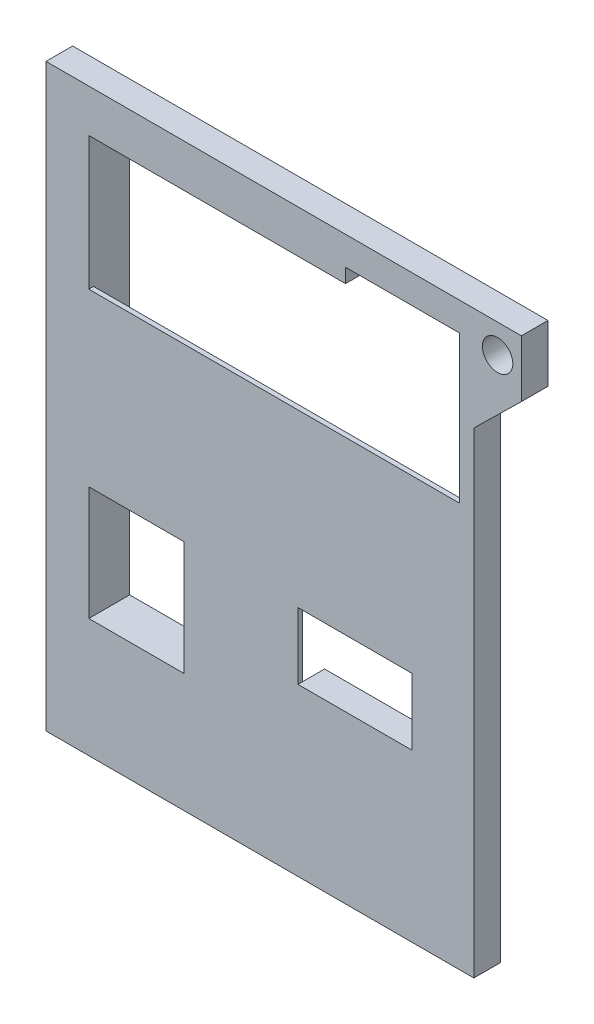
ISO-10303-21;
HEADER;
FILE_DESCRIPTION(('STEP AP214'),'2;1');
FILE_NAME('part.step','',(''),(''),'','','');
FILE_SCHEMA(('AUTOMOTIVE_DESIGN { 1 0 10303 214 1 1 1 1 }'));
ENDSEC;
DATA;
#1=APPLICATION_CONTEXT('core data for automotive mechanical design processes');
#2=APPLICATION_PROTOCOL_DEFINITION('international standard','automotive_design',2000,#1);
#3=PRODUCT_CONTEXT('',#1,'mechanical');
#4=PRODUCT('Part','Part','',(#3));
#5=PRODUCT_RELATED_PRODUCT_CATEGORY('part','',(#4));
#6=PRODUCT_DEFINITION_FORMATION('','',#4);
#7=PRODUCT_DEFINITION_CONTEXT('part definition',#1,'design');
#8=PRODUCT_DEFINITION('design','',#6,#7);
#9=PRODUCT_DEFINITION_SHAPE('','',#8);
#10=(LENGTH_UNIT() NAMED_UNIT(*) SI_UNIT(.MILLI.,.METRE.));
#11=(NAMED_UNIT(*) PLANE_ANGLE_UNIT() SI_UNIT($,.RADIAN.));
#12=(NAMED_UNIT(*) SI_UNIT($,.STERADIAN.) SOLID_ANGLE_UNIT());
#13=UNCERTAINTY_MEASURE_WITH_UNIT(LENGTH_MEASURE(1.E-05),#10,'distance_accuracy_value','');
#14=(GEOMETRIC_REPRESENTATION_CONTEXT(3) GLOBAL_UNCERTAINTY_ASSIGNED_CONTEXT((#13)) GLOBAL_UNIT_ASSIGNED_CONTEXT((#10,
#11,#12)) REPRESENTATION_CONTEXT('',''));
#15=CARTESIAN_POINT('',(0.,0.,0.));
#16=DIRECTION('',(0.,0.,1.));
#17=DIRECTION('',(1.,0.,0.));
#18=AXIS2_PLACEMENT_3D('',#15,#16,#17);
#19=CARTESIAN_POINT('',(4.00000000000001,0.,-2.8));
#20=DIRECTION('',(1.,0.,0.));
#21=DIRECTION('',(0.,0.,-1.));
#22=AXIS2_PLACEMENT_3D('',#19,#20,#21);
#23=PLANE('',#22);
#24=DIRECTION('',(0.,-1.,0.));
#25=VECTOR('',#24,1.);
#26=CARTESIAN_POINT('',(4.00000000000001,0.,-0.5));
#27=LINE('',#26,#25);
#28=CARTESIAN_POINT('',(4.00000000000001,-13.,-0.5));
#29=VERTEX_POINT('',#28);
#30=CARTESIAN_POINT('',(4.00000000000001,-18.,-0.5));
#31=VERTEX_POINT('',#30);
#32=EDGE_CURVE('E67',#29,#31,#27,.T.);
#33=ORIENTED_EDGE('',*,*,#32,.F.);
#34=DIRECTION('',(0.,0.,1.));
#35=VECTOR('',#34,1.);
#36=CARTESIAN_POINT('',(4.00000000000001,-13.,-2.8));
#37=LINE('',#36,#35);
#38=CARTESIAN_POINT('',(4.00000000000001,-13.,-2.8));
#39=VERTEX_POINT('',#38);
#40=EDGE_CURVE('E449',#39,#29,#37,.T.);
#41=ORIENTED_EDGE('',*,*,#40,.F.);
#42=DIRECTION('',(0.,1.,0.));
#43=VECTOR('',#42,1.);
#44=CARTESIAN_POINT('',(4.00000000000001,0.,-2.8));
#45=LINE('',#44,#43);
#46=CARTESIAN_POINT('',(4.00000000000001,-18.,-2.8));
#47=VERTEX_POINT('',#46);
#48=EDGE_CURVE('E377',#47,#39,#45,.T.);
#49=ORIENTED_EDGE('',*,*,#48,.F.);
#50=DIRECTION('',(0.,0.,1.));
#51=VECTOR('',#50,1.);
#52=CARTESIAN_POINT('',(4.00000000000001,-18.,-2.8));
#53=LINE('',#52,#51);
#54=EDGE_CURVE('E447',#47,#31,#53,.T.);
#55=ORIENTED_EDGE('',*,*,#54,.T.);
#56=EDGE_LOOP('',(#33,#41,#49,#55));
#57=FACE_BOUND('',#56,.T.);
#58=ADVANCED_FACE('F50',(#57),#23,.F.);
#59=CARTESIAN_POINT('',(0.,-9.27900262121284,-2.8));
#60=DIRECTION('',(0.,-1.,0.));
#61=DIRECTION('',(0.,0.,-1.));
#62=AXIS2_PLACEMENT_3D('',#59,#60,#61);
#63=PLANE('',#62);
#64=DIRECTION('',(1.,0.,0.));
#65=VECTOR('',#64,1.);
#66=CARTESIAN_POINT('',(0.,-9.27900262121284,-0.5));
#67=LINE('',#66,#65);
#68=CARTESIAN_POINT('',(16.,-9.27900262121284,-0.5));
#69=VERTEX_POINT('',#68);
#70=CARTESIAN_POINT('',(21.,-9.27900262121284,-0.5));
#71=VERTEX_POINT('',#70);
#72=EDGE_CURVE('E316',#69,#71,#67,.T.);
#73=ORIENTED_EDGE('',*,*,#72,.T.);
#74=DIRECTION('',(0.,0.,1.));
#75=VECTOR('',#74,1.);
#76=CARTESIAN_POINT('',(21.,-9.27900262121284,-2.8));
#77=LINE('',#76,#75);
#78=CARTESIAN_POINT('',(21.,-9.27900262121284,-2.8));
#79=VERTEX_POINT('',#78);
#80=EDGE_CURVE('E455',#79,#71,#77,.T.);
#81=ORIENTED_EDGE('',*,*,#80,.F.);
#82=DIRECTION('',(1.,0.,0.));
#83=VECTOR('',#82,1.);
#84=CARTESIAN_POINT('',(0.,-9.27900262121284,-2.8));
#85=LINE('',#84,#83);
#86=CARTESIAN_POINT('',(16.,-9.27900262121284,-2.8));
#87=VERTEX_POINT('',#86);
#88=EDGE_CURVE('E370',#87,#79,#85,.T.);
#89=ORIENTED_EDGE('',*,*,#88,.F.);
#90=DIRECTION('',(0.,0.,1.));
#91=VECTOR('',#90,1.);
#92=CARTESIAN_POINT('',(16.,-9.27900262121284,-2.8));
#93=LINE('',#92,#91);
#94=EDGE_CURVE('E75',#87,#69,#93,.T.);
#95=ORIENTED_EDGE('',*,*,#94,.T.);
#96=EDGE_LOOP('',(#73,#81,#89,#95));
#97=FACE_BOUND('',#96,.T.);
#98=ADVANCED_FACE('F489',(#97),#63,.F.);
#99=CARTESIAN_POINT('',(21.,0.,-2.8));
#100=DIRECTION('',(1.,0.,0.));
#101=DIRECTION('',(0.,0.,-1.));
#102=AXIS2_PLACEMENT_3D('',#99,#100,#101);
#103=PLANE('',#102);
#104=DIRECTION('',(0.,-1.,0.));
#105=VECTOR('',#104,1.);
#106=CARTESIAN_POINT('',(21.,0.,-0.5));
#107=LINE('',#106,#105);
#108=CARTESIAN_POINT('',(21.,12.,-0.5));
#109=VERTEX_POINT('',#108);
#110=EDGE_CURVE('E350',#109,#71,#107,.T.);
#111=ORIENTED_EDGE('',*,*,#110,.F.);
#112=DIRECTION('',(0.,0.,1.));
#113=VECTOR('',#112,1.);
#114=CARTESIAN_POINT('',(21.,12.,-0.5));
#115=LINE('',#114,#113);
#116=CARTESIAN_POINT('',(21.,12.,0.));
#117=VERTEX_POINT('',#116);
#118=EDGE_CURVE('E318',#109,#117,#115,.T.);
#119=ORIENTED_EDGE('',*,*,#118,.T.);
#120=DIRECTION('',(0.,1.,0.));
#121=VECTOR('',#120,1.);
#122=CARTESIAN_POINT('',(21.,0.,0.));
#123=LINE('',#122,#121);
#124=CARTESIAN_POINT('',(21.,27.5,0.));
#125=VERTEX_POINT('',#124);
#126=EDGE_CURVE('E411',#117,#125,#123,.T.);
#127=ORIENTED_EDGE('',*,*,#126,.T.);
#128=DIRECTION('',(0.,0.,1.));
#129=VECTOR('',#128,1.);
#130=CARTESIAN_POINT('',(21.,27.5,-2.8));
#131=LINE('',#130,#129);
#132=CARTESIAN_POINT('',(21.,27.5,-2.8));
#133=VERTEX_POINT('',#132);
#134=EDGE_CURVE('E458',#133,#125,#131,.T.);
#135=ORIENTED_EDGE('',*,*,#134,.F.);
#136=DIRECTION('',(0.,1.,0.));
#137=VECTOR('',#136,1.);
#138=CARTESIAN_POINT('',(21.,0.,-2.8));
#139=LINE('',#138,#137);
#140=EDGE_CURVE('E368',#79,#133,#139,.T.);
#141=ORIENTED_EDGE('',*,*,#140,.F.);
#142=ORIENTED_EDGE('',*,*,#80,.T.);
#143=EDGE_LOOP('',(#111,#119,#127,#135,#141,#142));
#144=FACE_BOUND('',#143,.T.);
#145=ADVANCED_FACE('F494',(#144),#103,.F.);
#146=CARTESIAN_POINT('',(0.,-30.5,-2.8));
#147=DIRECTION('',(0.,1.,0.));
#148=DIRECTION('',(-1.,0.,0.));
#149=AXIS2_PLACEMENT_3D('',#146,#147,#148);
#150=PLANE('',#149);
#151=DIRECTION('',(-1.,0.,0.));
#152=VECTOR('',#151,1.);
#153=CARTESIAN_POINT('',(0.,-30.5,0.));
#154=LINE('',#153,#152);
#155=CARTESIAN_POINT('',(22.5,-30.5,0.));
#156=VERTEX_POINT('',#155);
#157=CARTESIAN_POINT('',(-22.5,-30.5,0.));
#158=VERTEX_POINT('',#157);
#159=EDGE_CURVE('E418',#156,#158,#154,.T.);
#160=ORIENTED_EDGE('',*,*,#159,.T.);
#161=DIRECTION('',(0.,0.,1.));
#162=VECTOR('',#161,1.);
#163=CARTESIAN_POINT('',(-22.5,-30.5,-2.8));
#164=LINE('',#163,#162);
#165=CARTESIAN_POINT('',(-22.5,-30.5,-2.8));
#166=VERTEX_POINT('',#165);
#167=EDGE_CURVE('E12',#166,#158,#164,.T.);
#168=ORIENTED_EDGE('',*,*,#167,.F.);
#169=DIRECTION('',(-1.,0.,0.));
#170=VECTOR('',#169,1.);
#171=CARTESIAN_POINT('',(0.,-30.5,-2.8));
#172=LINE('',#171,#170);
#173=CARTESIAN_POINT('',(22.5,-30.5,-2.8));
#174=VERTEX_POINT('',#173);
#175=EDGE_CURVE('E385',#174,#166,#172,.T.);
#176=ORIENTED_EDGE('',*,*,#175,.F.);
#177=DIRECTION('',(0.,0.,1.));
#178=VECTOR('',#177,1.);
#179=CARTESIAN_POINT('',(22.5,-30.5,-2.8));
#180=LINE('',#179,#178);
#181=EDGE_CURVE('E445',#174,#156,#180,.T.);
#182=ORIENTED_EDGE('',*,*,#181,.T.);
#183=EDGE_LOOP('',(#160,#168,#176,#182));
#184=FACE_BOUND('',#183,.T.);
#185=ADVANCED_FACE('F590',(#184),#150,.F.);
#186=CARTESIAN_POINT('',(-22.5,0.,-2.8));
#187=DIRECTION('',(1.,0.,0.));
#188=DIRECTION('',(0.,0.,-1.));
#189=AXIS2_PLACEMENT_3D('',#186,#187,#188);
#190=PLANE('',#189);
#191=DIRECTION('',(0.,1.,0.));
#192=VECTOR('',#191,1.);
#193=CARTESIAN_POINT('',(-22.5,0.,0.));
#194=LINE('',#193,#192);
#195=CARTESIAN_POINT('',(-22.5,30.5,0.));
#196=VERTEX_POINT('',#195);
#197=EDGE_CURVE('E432',#158,#196,#194,.T.);
#198=ORIENTED_EDGE('',*,*,#197,.T.);
#199=DIRECTION('',(0.,0.,1.));
#200=VECTOR('',#199,1.);
#201=CARTESIAN_POINT('',(-22.5,30.5,-2.8));
#202=LINE('',#201,#200);
#203=CARTESIAN_POINT('',(-22.5,30.5,-2.8));
#204=VERTEX_POINT('',#203);
#205=EDGE_CURVE('E59',#204,#196,#202,.T.);
#206=ORIENTED_EDGE('',*,*,#205,.F.);
#207=DIRECTION('',(0.,1.,0.));
#208=VECTOR('',#207,1.);
#209=CARTESIAN_POINT('',(-22.5,0.,-2.8));
#210=LINE('',#209,#208);
#211=EDGE_CURVE('E398',#166,#204,#210,.T.);
#212=ORIENTED_EDGE('',*,*,#211,.F.);
#213=ORIENTED_EDGE('',*,*,#167,.T.);
#214=EDGE_LOOP('',(#198,#206,#212,#213));
#215=FACE_BOUND('',#214,.T.);
#216=ADVANCED_FACE('F586',(#215),#190,.F.);
#217=CARTESIAN_POINT('',(0.,30.5,-2.8));
#218=DIRECTION('',(0.,1.,0.));
#219=DIRECTION('',(-1.,0.,0.));
#220=AXIS2_PLACEMENT_3D('',#217,#218,#219);
#221=PLANE('',#220);
#222=ORIENTED_EDGE('',*,*,#205,.T.);
#223=DIRECTION('',(-1.,0.,0.));
#224=VECTOR('',#223,1.);
#225=CARTESIAN_POINT('',(0.,30.5,0.));
#226=LINE('',#225,#224);
#227=CARTESIAN_POINT('',(27.5,30.5,0.));
#228=VERTEX_POINT('',#227);
#229=EDGE_CURVE('E429',#228,#196,#226,.T.);
#230=ORIENTED_EDGE('',*,*,#229,.F.);
#231=DIRECTION('',(0.,0.,1.));
#232=VECTOR('',#231,1.);
#233=CARTESIAN_POINT('',(27.5,30.5,-2.8));
#234=LINE('',#233,#232);
#235=CARTESIAN_POINT('',(27.5,30.5,-2.8));
#236=VERTEX_POINT('',#235);
#237=EDGE_CURVE('E438',#236,#228,#234,.T.);
#238=ORIENTED_EDGE('',*,*,#237,.F.);
#239=DIRECTION('',(-1.,0.,0.));
#240=VECTOR('',#239,1.);
#241=CARTESIAN_POINT('',(0.,30.5,-2.8));
#242=LINE('',#241,#240);
#243=EDGE_CURVE('E395',#236,#204,#242,.T.);
#244=ORIENTED_EDGE('',*,*,#243,.T.);
#245=EDGE_LOOP('',(#222,#230,#238,#244));
#246=FACE_BOUND('',#245,.T.);
#247=ADVANCED_FACE('F589',(#246),#221,.T.);
#248=CARTESIAN_POINT('',(27.5,0.,-2.8));
#249=DIRECTION('',(-1.,0.,0.));
#250=DIRECTION('',(0.,0.,1.));
#251=AXIS2_PLACEMENT_3D('',#248,#249,#250);
#252=PLANE('',#251);
#253=DIRECTION('',(0.,-1.,0.));
#254=VECTOR('',#253,1.);
#255=CARTESIAN_POINT('',(27.5,0.,0.));
#256=LINE('',#255,#254);
#257=CARTESIAN_POINT('',(27.5,24.5,0.));
#258=VERTEX_POINT('',#257);
#259=EDGE_CURVE('E427',#228,#258,#256,.T.);
#260=ORIENTED_EDGE('',*,*,#259,.T.);
#261=DIRECTION('',(0.,0.,1.));
#262=VECTOR('',#261,1.);
#263=CARTESIAN_POINT('',(27.5,24.5,-2.8));
#264=LINE('',#263,#262);
#265=CARTESIAN_POINT('',(27.5,24.5,-2.8));
#266=VERTEX_POINT('',#265);
#267=EDGE_CURVE('E440',#266,#258,#264,.T.);
#268=ORIENTED_EDGE('',*,*,#267,.F.);
#269=DIRECTION('',(0.,-1.,0.));
#270=VECTOR('',#269,1.);
#271=CARTESIAN_POINT('',(27.5,0.,-2.8));
#272=LINE('',#271,#270);
#273=EDGE_CURVE('E393',#236,#266,#272,.T.);
#274=ORIENTED_EDGE('',*,*,#273,.F.);
#275=ORIENTED_EDGE('',*,*,#237,.T.);
#276=EDGE_LOOP('',(#260,#268,#274,#275));
#277=FACE_BOUND('',#276,.T.);
#278=ADVANCED_FACE('F594',(#277),#252,.F.);
#279=CARTESIAN_POINT('',(1.22193904118613,-1.24713631153823,-2.8));
#280=DIRECTION('',(-0.699854212223765,0.714285714285715,0.));
#281=DIRECTION('',(-0.714285714285715,-0.699854212223765,0.));
#282=AXIS2_PLACEMENT_3D('',#279,#280,#281);
#283=PLANE('',#282);
#284=DIRECTION('',(-0.714285714285715,-0.699854212223765,0.));
#285=VECTOR('',#284,1.);
#286=CARTESIAN_POINT('',(1.22193904118613,-1.24713631153823,0.));
#287=LINE('',#286,#285);
#288=CARTESIAN_POINT('',(22.5,19.6010205144337,0.));
#289=VERTEX_POINT('',#288);
#290=EDGE_CURVE('E424',#258,#289,#287,.T.);
#291=ORIENTED_EDGE('',*,*,#290,.T.);
#292=DIRECTION('',(0.,0.,1.));
#293=VECTOR('',#292,1.);
#294=CARTESIAN_POINT('',(22.5,19.6010205144337,-2.8));
#295=LINE('',#294,#293);
#296=CARTESIAN_POINT('',(22.5,19.6010205144337,-2.8));
#297=VERTEX_POINT('',#296);
#298=EDGE_CURVE('E443',#297,#289,#295,.T.);
#299=ORIENTED_EDGE('',*,*,#298,.F.);
#300=DIRECTION('',(-0.714285714285715,-0.699854212223765,0.));
#301=VECTOR('',#300,1.);
#302=CARTESIAN_POINT('',(1.22193904118613,-1.24713631153823,-2.8));
#303=LINE('',#302,#301);
#304=EDGE_CURVE('E391',#266,#297,#303,.T.);
#305=ORIENTED_EDGE('',*,*,#304,.F.);
#306=ORIENTED_EDGE('',*,*,#267,.T.);
#307=EDGE_LOOP('',(#291,#299,#305,#306));
#308=FACE_BOUND('',#307,.T.);
#309=ADVANCED_FACE('F503',(#308),#283,.F.);
#310=CARTESIAN_POINT('',(0.,-13.,-2.8));
#311=DIRECTION('',(0.,-1.,0.));
#312=DIRECTION('',(0.,0.,-1.));
#313=AXIS2_PLACEMENT_3D('',#310,#311,#312);
#314=PLANE('',#313);
#315=DIRECTION('',(1.,0.,0.));
#316=VECTOR('',#315,1.);
#317=CARTESIAN_POINT('',(0.,-13.,0.));
#318=LINE('',#317,#316);
#319=CARTESIAN_POINT('',(4.00000000000001,-13.,0.));
#320=VERTEX_POINT('',#319);
#321=CARTESIAN_POINT('',(16.,-13.,0.));
#322=VERTEX_POINT('',#321);
#323=EDGE_CURVE('E416',#320,#322,#318,.T.);
#324=ORIENTED_EDGE('',*,*,#323,.T.);
#325=DIRECTION('',(0.,0.,1.));
#326=VECTOR('',#325,1.);
#327=CARTESIAN_POINT('',(16.,-13.,-2.8));
#328=LINE('',#327,#326);
#329=CARTESIAN_POINT('',(16.,-13.,-2.8));
#330=VERTEX_POINT('',#329);
#331=EDGE_CURVE('E451',#330,#322,#328,.T.);
#332=ORIENTED_EDGE('',*,*,#331,.F.);
#333=DIRECTION('',(1.,0.,0.));
#334=VECTOR('',#333,1.);
#335=CARTESIAN_POINT('',(0.,-13.,-2.8));
#336=LINE('',#335,#334);
#337=EDGE_CURVE('E375',#39,#330,#336,.T.);
#338=ORIENTED_EDGE('',*,*,#337,.F.);
#339=ORIENTED_EDGE('',*,*,#40,.T.);
#340=DIRECTION('',(0.,0.,-1.));
#341=VECTOR('',#340,1.);
#342=CARTESIAN_POINT('',(4.00000000000001,-13.,-2.8));
#343=LINE('',#342,#341);
#344=EDGE_CURVE('E332',#320,#29,#343,.T.);
#345=ORIENTED_EDGE('',*,*,#344,.F.);
#346=EDGE_LOOP('',(#324,#332,#338,#339,#345));
#347=FACE_BOUND('',#346,.T.);
#348=ADVANCED_FACE('F499',(#347),#314,.F.);
#349=CARTESIAN_POINT('',(16.,0.,-2.8));
#350=DIRECTION('',(1.,0.,0.));
#351=DIRECTION('',(0.,1.,0.));
#352=AXIS2_PLACEMENT_3D('',#349,#350,#351);
#353=PLANE('',#352);
#354=DIRECTION('',(0.,1.,0.));
#355=VECTOR('',#354,1.);
#356=CARTESIAN_POINT('',(16.,0.,0.));
#357=LINE('',#356,#355);
#358=CARTESIAN_POINT('',(16.,-5.99999999999999,0.));
#359=VERTEX_POINT('',#358);
#360=EDGE_CURVE('E414',#322,#359,#357,.T.);
#361=ORIENTED_EDGE('',*,*,#360,.T.);
#362=DIRECTION('',(0.,0.,1.));
#363=VECTOR('',#362,1.);
#364=CARTESIAN_POINT('',(16.,-5.99999999999999,-0.5));
#365=LINE('',#364,#363);
#366=CARTESIAN_POINT('',(16.,-5.99999999999999,-0.5));
#367=VERTEX_POINT('',#366);
#368=EDGE_CURVE('E329',#367,#359,#365,.T.);
#369=ORIENTED_EDGE('',*,*,#368,.F.);
#370=DIRECTION('',(0.,1.,0.));
#371=VECTOR('',#370,1.);
#372=CARTESIAN_POINT('',(16.,0.,-0.5));
#373=LINE('',#372,#371);
#374=EDGE_CURVE('E314',#69,#367,#373,.T.);
#375=ORIENTED_EDGE('',*,*,#374,.F.);
#376=ORIENTED_EDGE('',*,*,#94,.F.);
#377=DIRECTION('',(0.,1.,0.));
#378=VECTOR('',#377,1.);
#379=CARTESIAN_POINT('',(16.,0.,-2.8));
#380=LINE('',#379,#378);
#381=EDGE_CURVE('E373',#330,#87,#380,.T.);
#382=ORIENTED_EDGE('',*,*,#381,.F.);
#383=ORIENTED_EDGE('',*,*,#331,.T.);
#384=EDGE_LOOP('',(#361,#369,#375,#376,#382,#383));
#385=FACE_BOUND('',#384,.T.);
#386=ADVANCED_FACE('F502',(#385),#353,.F.);
#387=CARTESIAN_POINT('',(0.,27.5,-2.8));
#388=DIRECTION('',(0.,-1.,0.));
#389=DIRECTION('',(0.,0.,-1.));
#390=AXIS2_PLACEMENT_3D('',#387,#388,#389);
#391=PLANE('',#390);
#392=DIRECTION('',(1.,0.,0.));
#393=VECTOR('',#392,1.);
#394=CARTESIAN_POINT('',(0.,27.5,0.));
#395=LINE('',#394,#393);
#396=CARTESIAN_POINT('',(9.00000000000001,27.5,0.));
#397=VERTEX_POINT('',#396);
#398=EDGE_CURVE('E408',#397,#125,#395,.T.);
#399=ORIENTED_EDGE('',*,*,#398,.F.);
#400=DIRECTION('',(0.,0.,1.));
#401=VECTOR('',#400,1.);
#402=CARTESIAN_POINT('',(9.00000000000001,27.5,-2.8));
#403=LINE('',#402,#401);
#404=CARTESIAN_POINT('',(9.00000000000001,27.5,-2.8));
#405=VERTEX_POINT('',#404);
#406=EDGE_CURVE('E460',#405,#397,#403,.T.);
#407=ORIENTED_EDGE('',*,*,#406,.F.);
#408=DIRECTION('',(1.,0.,0.));
#409=VECTOR('',#408,1.);
#410=CARTESIAN_POINT('',(0.,27.5,-2.8));
#411=LINE('',#410,#409);
#412=EDGE_CURVE('E365',#405,#133,#411,.T.);
#413=ORIENTED_EDGE('',*,*,#412,.T.);
#414=ORIENTED_EDGE('',*,*,#134,.T.);
#415=EDGE_LOOP('',(#399,#407,#413,#414));
#416=FACE_BOUND('',#415,.T.);
#417=ADVANCED_FACE('F486',(#416),#391,.T.);
#418=CARTESIAN_POINT('',(9.00000000000001,0.,-2.8));
#419=DIRECTION('',(1.,0.,0.));
#420=DIRECTION('',(0.,0.,-1.));
#421=AXIS2_PLACEMENT_3D('',#418,#419,#420);
#422=PLANE('',#421);
#423=DIRECTION('',(0.,1.,0.));
#424=VECTOR('',#423,1.);
#425=CARTESIAN_POINT('',(9.00000000000001,0.,0.));
#426=LINE('',#425,#424);
#427=CARTESIAN_POINT('',(9.00000000000001,26.,0.));
#428=VERTEX_POINT('',#427);
#429=EDGE_CURVE('E405',#428,#397,#426,.T.);
#430=ORIENTED_EDGE('',*,*,#429,.F.);
#431=DIRECTION('',(0.,0.,1.));
#432=VECTOR('',#431,1.);
#433=CARTESIAN_POINT('',(9.00000000000001,26.,-2.8));
#434=LINE('',#433,#432);
#435=CARTESIAN_POINT('',(9.00000000000001,26.,-2.8));
#436=VERTEX_POINT('',#435);
#437=EDGE_CURVE('E461',#436,#428,#434,.T.);
#438=ORIENTED_EDGE('',*,*,#437,.F.);
#439=DIRECTION('',(0.,1.,0.));
#440=VECTOR('',#439,1.);
#441=CARTESIAN_POINT('',(9.00000000000001,0.,-2.8));
#442=LINE('',#441,#440);
#443=EDGE_CURVE('E362',#436,#405,#442,.T.);
#444=ORIENTED_EDGE('',*,*,#443,.T.);
#445=ORIENTED_EDGE('',*,*,#406,.T.);
#446=EDGE_LOOP('',(#430,#438,#444,#445));
#447=FACE_BOUND('',#446,.T.);
#448=ADVANCED_FACE('F478',(#447),#422,.T.);
#449=CARTESIAN_POINT('',(0.,26.,-2.8));
#450=DIRECTION('',(0.,-1.,0.));
#451=DIRECTION('',(0.,0.,-1.));
#452=AXIS2_PLACEMENT_3D('',#449,#450,#451);
#453=PLANE('',#452);
#454=DIRECTION('',(1.,0.,0.));
#455=VECTOR('',#454,1.);
#456=CARTESIAN_POINT('',(0.,26.,0.));
#457=LINE('',#456,#455);
#458=CARTESIAN_POINT('',(-18.,26.,0.));
#459=VERTEX_POINT('',#458);
#460=EDGE_CURVE('E353',#459,#428,#457,.T.);
#461=ORIENTED_EDGE('',*,*,#460,.F.);
#462=DIRECTION('',(0.,0.,1.));
#463=VECTOR('',#462,1.);
#464=CARTESIAN_POINT('',(-18.,26.,-2.8));
#465=LINE('',#464,#463);
#466=CARTESIAN_POINT('',(-18.,26.,-2.8));
#467=VERTEX_POINT('',#466);
#468=EDGE_CURVE('E54',#467,#459,#465,.T.);
#469=ORIENTED_EDGE('',*,*,#468,.F.);
#470=DIRECTION('',(1.,0.,0.));
#471=VECTOR('',#470,1.);
#472=CARTESIAN_POINT('',(0.,26.,-2.8));
#473=LINE('',#472,#471);
#474=EDGE_CURVE('E359',#467,#436,#473,.T.);
#475=ORIENTED_EDGE('',*,*,#474,.T.);
#476=ORIENTED_EDGE('',*,*,#437,.T.);
#477=EDGE_LOOP('',(#461,#469,#475,#476));
#478=FACE_BOUND('',#477,.T.);
#479=ADVANCED_FACE('F52',(#478),#453,.T.);
#480=CARTESIAN_POINT('',(22.5,0.,-2.8));
#481=DIRECTION('',(1.,0.,0.));
#482=DIRECTION('',(0.,0.,-1.));
#483=AXIS2_PLACEMENT_3D('',#480,#481,#482);
#484=PLANE('',#483);
#485=DIRECTION('',(0.,1.,0.));
#486=VECTOR('',#485,1.);
#487=CARTESIAN_POINT('',(22.5,0.,0.));
#488=LINE('',#487,#486);
#489=EDGE_CURVE('E421',#156,#289,#488,.T.);
#490=ORIENTED_EDGE('',*,*,#489,.F.);
#491=ORIENTED_EDGE('',*,*,#181,.F.);
#492=DIRECTION('',(0.,1.,0.));
#493=VECTOR('',#492,1.);
#494=CARTESIAN_POINT('',(22.5,0.,-2.8));
#495=LINE('',#494,#493);
#496=EDGE_CURVE('E388',#174,#297,#495,.T.);
#497=ORIENTED_EDGE('',*,*,#496,.T.);
#498=ORIENTED_EDGE('',*,*,#298,.T.);
#499=EDGE_LOOP('',(#490,#491,#497,#498));
#500=FACE_BOUND('',#499,.T.);
#501=ADVANCED_FACE('F477',(#500),#484,.T.);
#502=CARTESIAN_POINT('',(25.,27.5,-2.8));
#503=DIRECTION('',(0.,0.,1.));
#504=DIRECTION('',(1.,0.,0.));
#505=AXIS2_PLACEMENT_3D('',#502,#503,#504);
#506=CYLINDRICAL_SURFACE('',#505,1.6);
#507=CARTESIAN_POINT('',(25.,27.5,-2.8));
#508=DIRECTION('',(0.,0.,1.));
#509=DIRECTION('',(1.,0.,0.));
#510=AXIS2_PLACEMENT_3D('',#507,#508,#509);
#511=CIRCLE('',#510,1.6);
#512=CARTESIAN_POINT('',(26.6,27.5,-2.8));
#513=VERTEX_POINT('',#512);
#514=EDGE_CURVE('E400',#513,#513,#511,.T.);
#515=ORIENTED_EDGE('',*,*,#514,.F.);
#516=EDGE_LOOP('',(#515));
#517=FACE_BOUND('',#516,.T.);
#518=CARTESIAN_POINT('',(25.,27.5,0.));
#519=DIRECTION('',(0.,0.,1.));
#520=DIRECTION('',(1.,0.,0.));
#521=AXIS2_PLACEMENT_3D('',#518,#519,#520);
#522=CIRCLE('',#521,1.6);
#523=CARTESIAN_POINT('',(26.6,27.5,0.));
#524=VERTEX_POINT('',#523);
#525=EDGE_CURVE('E357',#524,#524,#522,.T.);
#526=ORIENTED_EDGE('',*,*,#525,.T.);
#527=EDGE_LOOP('',(#526));
#528=FACE_BOUND('',#527,.T.);
#529=ADVANCED_FACE('F483',(#517,#528),#506,.F.);
#530=CARTESIAN_POINT('',(0.,0.,-2.8));
#531=DIRECTION('',(0.,0.,1.));
#532=DIRECTION('',(1.,0.,0.));
#533=AXIS2_PLACEMENT_3D('',#530,#531,#532);
#534=PLANE('',#533);
#535=DIRECTION('',(-1.,0.,0.));
#536=VECTOR('',#535,1.);
#537=CARTESIAN_POINT('',(0.,29.,-2.8));
#538=LINE('',#537,#536);
#539=CARTESIAN_POINT('',(-18.,29.,-2.8));
#540=VERTEX_POINT('',#539);
#541=CARTESIAN_POINT('',(-20.5,29.,-2.8));
#542=VERTEX_POINT('',#541);
#543=EDGE_CURVE('E354',#540,#542,#538,.T.);
#544=ORIENTED_EDGE('',*,*,#543,.T.);
#545=DIRECTION('',(0.,-1.,0.));
#546=VECTOR('',#545,1.);
#547=CARTESIAN_POINT('',(-20.5,0.,-2.8));
#548=LINE('',#547,#546);
#549=CARTESIAN_POINT('',(-20.5,-29.,-2.8));
#550=VERTEX_POINT('',#549);
#551=EDGE_CURVE('E248',#542,#550,#548,.T.);
#552=ORIENTED_EDGE('',*,*,#551,.T.);
#553=DIRECTION('',(-1.,0.,0.));
#554=VECTOR('',#553,1.);
#555=CARTESIAN_POINT('',(0.,-29.,-2.8));
#556=LINE('',#555,#554);
#557=CARTESIAN_POINT('',(21.,-29.,-2.8));
#558=VERTEX_POINT('',#557);
#559=EDGE_CURVE('E382',#558,#550,#556,.T.);
#560=ORIENTED_EDGE('',*,*,#559,.F.);
#561=CARTESIAN_POINT('',(21.,-18.,-2.8));
#562=VERTEX_POINT('',#561);
#563=EDGE_CURVE('E371',#558,#562,#139,.T.);
#564=ORIENTED_EDGE('',*,*,#563,.T.);
#565=DIRECTION('',(-1.,0.,0.));
#566=VECTOR('',#565,1.);
#567=CARTESIAN_POINT('',(0.,-18.,-2.8));
#568=LINE('',#567,#566);
#569=EDGE_CURVE('E379',#562,#47,#568,.T.);
#570=ORIENTED_EDGE('',*,*,#569,.T.);
#571=ORIENTED_EDGE('',*,*,#48,.T.);
#572=ORIENTED_EDGE('',*,*,#337,.T.);
#573=ORIENTED_EDGE('',*,*,#381,.T.);
#574=ORIENTED_EDGE('',*,*,#88,.T.);
#575=ORIENTED_EDGE('',*,*,#140,.T.);
#576=ORIENTED_EDGE('',*,*,#412,.F.);
#577=ORIENTED_EDGE('',*,*,#443,.F.);
#578=ORIENTED_EDGE('',*,*,#474,.F.);
#579=DIRECTION('',(0.,-1.,0.));
#580=VECTOR('',#579,1.);
#581=CARTESIAN_POINT('',(-18.,0.,-2.8));
#582=LINE('',#581,#580);
#583=EDGE_CURVE('E356',#540,#467,#582,.T.);
#584=ORIENTED_EDGE('',*,*,#583,.F.);
#585=EDGE_LOOP('',(#544,#552,#560,#564,#570,#571,#572,#573,#574,#575,#576,#577,#578,#584));
#586=FACE_BOUND('',#585,.T.);
#587=ORIENTED_EDGE('',*,*,#175,.T.);
#588=ORIENTED_EDGE('',*,*,#211,.T.);
#589=ORIENTED_EDGE('',*,*,#243,.F.);
#590=ORIENTED_EDGE('',*,*,#273,.T.);
#591=ORIENTED_EDGE('',*,*,#304,.T.);
#592=ORIENTED_EDGE('',*,*,#496,.F.);
#593=EDGE_LOOP('',(#587,#588,#589,#590,#591,#592));
#594=FACE_BOUND('',#593,.T.);
#595=ORIENTED_EDGE('',*,*,#514,.T.);
#596=EDGE_LOOP('',(#595));
#597=FACE_BOUND('',#596,.T.);
#598=ADVANCED_FACE('F517',(#586,#594,#597),#534,.F.);
#599=CARTESIAN_POINT('',(0.,0.,0.));
#600=DIRECTION('',(0.,0.,1.));
#601=DIRECTION('',(1.,0.,0.));
#602=AXIS2_PLACEMENT_3D('',#599,#600,#601);
#603=PLANE('',#602);
#604=DIRECTION('',(0.,-1.,0.));
#605=VECTOR('',#604,1.);
#606=CARTESIAN_POINT('',(-18.,0.,0.));
#607=LINE('',#606,#605);
#608=CARTESIAN_POINT('',(-18.,12.,0.));
#609=VERTEX_POINT('',#608);
#610=EDGE_CURVE('E268',#459,#609,#607,.T.);
#611=ORIENTED_EDGE('',*,*,#610,.F.);
#612=ORIENTED_EDGE('',*,*,#460,.T.);
#613=ORIENTED_EDGE('',*,*,#429,.T.);
#614=ORIENTED_EDGE('',*,*,#398,.T.);
#615=ORIENTED_EDGE('',*,*,#126,.F.);
#616=DIRECTION('',(1.,0.,0.));
#617=VECTOR('',#616,1.);
#618=CARTESIAN_POINT('',(0.,12.,0.));
#619=LINE('',#618,#617);
#620=EDGE_CURVE('E285',#609,#117,#619,.T.);
#621=ORIENTED_EDGE('',*,*,#620,.F.);
#622=EDGE_LOOP('',(#611,#612,#613,#614,#615,#621));
#623=FACE_BOUND('',#622,.T.);
#624=DIRECTION('',(0.,1.,0.));
#625=VECTOR('',#624,1.);
#626=CARTESIAN_POINT('',(-7.99999999999999,0.,0.));
#627=LINE('',#626,#625);
#628=CARTESIAN_POINT('',(-7.99999999999999,-18.,0.));
#629=VERTEX_POINT('',#628);
#630=CARTESIAN_POINT('',(-7.99999999999999,-5.99999999999999,0.));
#631=VERTEX_POINT('',#630);
#632=EDGE_CURVE('E324',#629,#631,#627,.T.);
#633=ORIENTED_EDGE('',*,*,#632,.F.);
#634=DIRECTION('',(-1.,0.,0.));
#635=VECTOR('',#634,1.);
#636=CARTESIAN_POINT('',(0.,-18.,0.));
#637=LINE('',#636,#635);
#638=CARTESIAN_POINT('',(-18.,-18.,0.));
#639=VERTEX_POINT('',#638);
#640=EDGE_CURVE('E281',#629,#639,#637,.T.);
#641=ORIENTED_EDGE('',*,*,#640,.T.);
#642=CARTESIAN_POINT('',(-18.,-5.99999999999999,0.));
#643=VERTEX_POINT('',#642);
#644=EDGE_CURVE('E270',#643,#639,#607,.T.);
#645=ORIENTED_EDGE('',*,*,#644,.F.);
#646=DIRECTION('',(-1.,0.,0.));
#647=VECTOR('',#646,1.);
#648=CARTESIAN_POINT('',(0.,-5.99999999999999,0.));
#649=LINE('',#648,#647);
#650=EDGE_CURVE('E321',#631,#643,#649,.T.);
#651=ORIENTED_EDGE('',*,*,#650,.F.);
#652=EDGE_LOOP('',(#633,#641,#645,#651));
#653=FACE_BOUND('',#652,.T.);
#654=ORIENTED_EDGE('',*,*,#229,.T.);
#655=ORIENTED_EDGE('',*,*,#197,.F.);
#656=ORIENTED_EDGE('',*,*,#159,.F.);
#657=ORIENTED_EDGE('',*,*,#489,.T.);
#658=ORIENTED_EDGE('',*,*,#290,.F.);
#659=ORIENTED_EDGE('',*,*,#259,.F.);
#660=EDGE_LOOP('',(#654,#655,#656,#657,#658,#659));
#661=FACE_BOUND('',#660,.T.);
#662=ORIENTED_EDGE('',*,*,#525,.F.);
#663=EDGE_LOOP('',(#662));
#664=FACE_BOUND('',#663,.T.);
#665=CARTESIAN_POINT('',(4.00000000000001,-5.99999999999999,0.));
#666=VERTEX_POINT('',#665);
#667=EDGE_CURVE('E300',#359,#666,#649,.T.);
#668=ORIENTED_EDGE('',*,*,#667,.F.);
#669=ORIENTED_EDGE('',*,*,#360,.F.);
#670=ORIENTED_EDGE('',*,*,#323,.F.);
#671=DIRECTION('',(0.,-1.,0.));
#672=VECTOR('',#671,1.);
#673=CARTESIAN_POINT('',(4.00000000000001,0.,0.));
#674=LINE('',#673,#672);
#675=EDGE_CURVE('E326',#666,#320,#674,.T.);
#676=ORIENTED_EDGE('',*,*,#675,.F.);
#677=EDGE_LOOP('',(#668,#669,#670,#676));
#678=FACE_BOUND('',#677,.T.);
#679=ADVANCED_FACE('F473',(#623,#653,#661,#664,#678),#603,.T.);
#680=CARTESIAN_POINT('',(0.,0.,-0.5));
#681=DIRECTION('',(0.,0.,1.));
#682=DIRECTION('',(1.,0.,0.));
#683=AXIS2_PLACEMENT_3D('',#680,#681,#682);
#684=PLANE('',#683);
#685=DIRECTION('',(1.,0.,0.));
#686=VECTOR('',#685,1.);
#687=CARTESIAN_POINT('',(0.,12.,-0.5));
#688=LINE('',#687,#686);
#689=CARTESIAN_POINT('',(-18.,12.,-0.5));
#690=VERTEX_POINT('',#689);
#691=EDGE_CURVE('E296',#690,#109,#688,.T.);
#692=ORIENTED_EDGE('',*,*,#691,.T.);
#693=ORIENTED_EDGE('',*,*,#110,.T.);
#694=ORIENTED_EDGE('',*,*,#72,.F.);
#695=ORIENTED_EDGE('',*,*,#374,.T.);
#696=DIRECTION('',(-1.,0.,0.));
#697=VECTOR('',#696,1.);
#698=CARTESIAN_POINT('',(0.,-5.99999999999999,-0.5));
#699=LINE('',#698,#697);
#700=CARTESIAN_POINT('',(4.00000000000001,-5.99999999999999,-0.5));
#701=VERTEX_POINT('',#700);
#702=EDGE_CURVE('E306',#367,#701,#699,.T.);
#703=ORIENTED_EDGE('',*,*,#702,.T.);
#704=EDGE_CURVE('E311',#701,#29,#27,.T.);
#705=ORIENTED_EDGE('',*,*,#704,.T.);
#706=ORIENTED_EDGE('',*,*,#32,.T.);
#707=DIRECTION('',(-1.,0.,0.));
#708=VECTOR('',#707,1.);
#709=CARTESIAN_POINT('',(0.,-18.,-0.5));
#710=LINE('',#709,#708);
#711=CARTESIAN_POINT('',(-7.99999999999999,-18.,-0.5));
#712=VERTEX_POINT('',#711);
#713=EDGE_CURVE('E308',#31,#712,#710,.T.);
#714=ORIENTED_EDGE('',*,*,#713,.T.);
#715=DIRECTION('',(0.,1.,0.));
#716=VECTOR('',#715,1.);
#717=CARTESIAN_POINT('',(-7.99999999999999,0.,-0.5));
#718=LINE('',#717,#716);
#719=CARTESIAN_POINT('',(-7.99999999999999,-5.99999999999999,-0.5));
#720=VERTEX_POINT('',#719);
#721=EDGE_CURVE('E305',#712,#720,#718,.T.);
#722=ORIENTED_EDGE('',*,*,#721,.T.);
#723=CARTESIAN_POINT('',(-18.,-5.99999999999999,-0.5));
#724=VERTEX_POINT('',#723);
#725=EDGE_CURVE('E302',#720,#724,#699,.T.);
#726=ORIENTED_EDGE('',*,*,#725,.T.);
#727=DIRECTION('',(0.,-1.,0.));
#728=VECTOR('',#727,1.);
#729=CARTESIAN_POINT('',(-18.,0.,-0.5));
#730=LINE('',#729,#728);
#731=EDGE_CURVE('E299',#690,#724,#730,.T.);
#732=ORIENTED_EDGE('',*,*,#731,.F.);
#733=EDGE_LOOP('',(#692,#693,#694,#695,#703,#705,#706,#714,#722,#726,#732));
#734=FACE_BOUND('',#733,.T.);
#735=ADVANCED_FACE('F531',(#734),#684,.F.);
#736=CARTESIAN_POINT('',(4.00000000000001,0.,-0.5));
#737=DIRECTION('',(-1.,0.,0.));
#738=DIRECTION('',(0.,-1.,0.));
#739=AXIS2_PLACEMENT_3D('',#736,#737,#738);
#740=PLANE('',#739);
#741=ORIENTED_EDGE('',*,*,#675,.T.);
#742=ORIENTED_EDGE('',*,*,#344,.T.);
#743=ORIENTED_EDGE('',*,*,#704,.F.);
#744=DIRECTION('',(0.,0.,1.));
#745=VECTOR('',#744,1.);
#746=CARTESIAN_POINT('',(4.00000000000001,-5.99999999999999,-0.5));
#747=LINE('',#746,#745);
#748=EDGE_CURVE('E333',#701,#666,#747,.T.);
#749=ORIENTED_EDGE('',*,*,#748,.T.);
#750=EDGE_LOOP('',(#741,#742,#743,#749));
#751=FACE_BOUND('',#750,.T.);
#752=ADVANCED_FACE('F565',(#751),#740,.F.);
#753=CARTESIAN_POINT('',(0.,-5.99999999999999,-0.5));
#754=DIRECTION('',(0.,1.,0.));
#755=DIRECTION('',(-1.,0.,0.));
#756=AXIS2_PLACEMENT_3D('',#753,#754,#755);
#757=PLANE('',#756);
#758=ORIENTED_EDGE('',*,*,#667,.T.);
#759=ORIENTED_EDGE('',*,*,#748,.F.);
#760=ORIENTED_EDGE('',*,*,#702,.F.);
#761=ORIENTED_EDGE('',*,*,#368,.T.);
#762=EDGE_LOOP('',(#758,#759,#760,#761));
#763=FACE_BOUND('',#762,.T.);
#764=ADVANCED_FACE('F561',(#763),#757,.F.);
#765=CARTESIAN_POINT('',(-7.99999999999999,0.,-0.5));
#766=DIRECTION('',(1.,0.,0.));
#767=DIRECTION('',(0.,0.,-1.));
#768=AXIS2_PLACEMENT_3D('',#765,#766,#767);
#769=PLANE('',#768);
#770=ORIENTED_EDGE('',*,*,#632,.T.);
#771=DIRECTION('',(0.,0.,1.));
#772=VECTOR('',#771,1.);
#773=CARTESIAN_POINT('',(-7.99999999999999,-5.99999999999999,-0.5));
#774=LINE('',#773,#772);
#775=EDGE_CURVE('E339',#720,#631,#774,.T.);
#776=ORIENTED_EDGE('',*,*,#775,.F.);
#777=ORIENTED_EDGE('',*,*,#721,.F.);
#778=DIRECTION('',(0.,0.,1.));
#779=VECTOR('',#778,1.);
#780=CARTESIAN_POINT('',(-7.99999999999999,-18.,-0.5));
#781=LINE('',#780,#779);
#782=EDGE_CURVE('E336',#712,#629,#781,.T.);
#783=ORIENTED_EDGE('',*,*,#782,.T.);
#784=EDGE_LOOP('',(#770,#776,#777,#783));
#785=FACE_BOUND('',#784,.T.);
#786=ADVANCED_FACE('F567',(#785),#769,.F.);
#787=ORIENTED_EDGE('',*,*,#650,.T.);
#788=DIRECTION('',(0.,0.,1.));
#789=VECTOR('',#788,1.);
#790=CARTESIAN_POINT('',(-18.,-5.99999999999999,-0.5));
#791=LINE('',#790,#789);
#792=EDGE_CURVE('E342',#724,#643,#791,.T.);
#793=ORIENTED_EDGE('',*,*,#792,.F.);
#794=ORIENTED_EDGE('',*,*,#725,.F.);
#795=ORIENTED_EDGE('',*,*,#775,.T.);
#796=EDGE_LOOP('',(#787,#793,#794,#795));
#797=FACE_BOUND('',#796,.T.);
#798=ADVANCED_FACE('F535',(#797),#757,.F.);
#799=CARTESIAN_POINT('',(0.,12.,-0.5));
#800=DIRECTION('',(0.,-1.,0.));
#801=DIRECTION('',(0.,0.,-1.));
#802=AXIS2_PLACEMENT_3D('',#799,#800,#801);
#803=PLANE('',#802);
#804=ORIENTED_EDGE('',*,*,#620,.T.);
#805=ORIENTED_EDGE('',*,*,#118,.F.);
#806=ORIENTED_EDGE('',*,*,#691,.F.);
#807=DIRECTION('',(0.,0.,1.));
#808=VECTOR('',#807,1.);
#809=CARTESIAN_POINT('',(-18.,12.,-0.5));
#810=LINE('',#809,#808);
#811=EDGE_CURVE('E344',#690,#609,#810,.T.);
#812=ORIENTED_EDGE('',*,*,#811,.T.);
#813=EDGE_LOOP('',(#804,#805,#806,#812));
#814=FACE_BOUND('',#813,.T.);
#815=ADVANCED_FACE('F524',(#814),#803,.F.);
#816=CARTESIAN_POINT('',(0.,29.,-4.3));
#817=DIRECTION('',(0.,1.,0.));
#818=DIRECTION('',(-1.,0.,0.));
#819=AXIS2_PLACEMENT_3D('',#816,#817,#818);
#820=PLANE('',#819);
#821=ORIENTED_EDGE('',*,*,#543,.F.);
#822=DIRECTION('',(0.,0.,1.));
#823=VECTOR('',#822,1.);
#824=CARTESIAN_POINT('',(-18.,29.,-4.3));
#825=LINE('',#824,#823);
#826=CARTESIAN_POINT('',(-18.,29.,-4.3));
#827=VERTEX_POINT('',#826);
#828=EDGE_CURVE('E266',#827,#540,#825,.T.);
#829=ORIENTED_EDGE('',*,*,#828,.F.);
#830=DIRECTION('',(-1.,0.,0.));
#831=VECTOR('',#830,1.);
#832=CARTESIAN_POINT('',(0.,29.,-4.3));
#833=LINE('',#832,#831);
#834=CARTESIAN_POINT('',(-20.5,29.,-4.3));
#835=VERTEX_POINT('',#834);
#836=EDGE_CURVE('E258',#827,#835,#833,.T.);
#837=ORIENTED_EDGE('',*,*,#836,.T.);
#838=DIRECTION('',(0.,0.,1.));
#839=VECTOR('',#838,1.);
#840=CARTESIAN_POINT('',(-20.5,29.,-4.3));
#841=LINE('',#840,#839);
#842=EDGE_CURVE('E242',#835,#542,#841,.T.);
#843=ORIENTED_EDGE('',*,*,#842,.T.);
#844=EDGE_LOOP('',(#821,#829,#837,#843));
#845=FACE_BOUND('',#844,.T.);
#846=ADVANCED_FACE('F264',(#845),#820,.T.);
#847=CARTESIAN_POINT('',(21.,0.,-4.3));
#848=DIRECTION('',(1.,0.,0.));
#849=DIRECTION('',(0.,0.,-1.));
#850=AXIS2_PLACEMENT_3D('',#847,#848,#849);
#851=PLANE('',#850);
#852=ORIENTED_EDGE('',*,*,#563,.F.);
#853=DIRECTION('',(0.,0.,1.));
#854=VECTOR('',#853,1.);
#855=CARTESIAN_POINT('',(21.,-29.,-4.3));
#856=LINE('',#855,#854);
#857=CARTESIAN_POINT('',(21.,-29.,-4.3));
#858=VERTEX_POINT('',#857);
#859=EDGE_CURVE('E292',#858,#558,#856,.T.);
#860=ORIENTED_EDGE('',*,*,#859,.F.);
#861=DIRECTION('',(0.,1.,0.));
#862=VECTOR('',#861,1.);
#863=CARTESIAN_POINT('',(21.,0.,-4.3));
#864=LINE('',#863,#862);
#865=CARTESIAN_POINT('',(21.,-18.,-4.3));
#866=VERTEX_POINT('',#865);
#867=EDGE_CURVE('E274',#858,#866,#864,.T.);
#868=ORIENTED_EDGE('',*,*,#867,.T.);
#869=DIRECTION('',(0.,0.,1.));
#870=VECTOR('',#869,1.);
#871=CARTESIAN_POINT('',(21.,-18.,-4.3));
#872=LINE('',#871,#870);
#873=EDGE_CURVE('E289',#866,#562,#872,.T.);
#874=ORIENTED_EDGE('',*,*,#873,.T.);
#875=EDGE_LOOP('',(#852,#860,#868,#874));
#876=FACE_BOUND('',#875,.T.);
#877=ADVANCED_FACE('F544',(#876),#851,.T.);
#878=CARTESIAN_POINT('',(0.,-29.,-4.3));
#879=DIRECTION('',(0.,1.,0.));
#880=DIRECTION('',(-1.,0.,0.));
#881=AXIS2_PLACEMENT_3D('',#878,#879,#880);
#882=PLANE('',#881);
#883=ORIENTED_EDGE('',*,*,#859,.T.);
#884=ORIENTED_EDGE('',*,*,#559,.T.);
#885=DIRECTION('',(0.,0.,1.));
#886=VECTOR('',#885,1.);
#887=CARTESIAN_POINT('',(-20.5,-29.,-4.3));
#888=LINE('',#887,#886);
#889=CARTESIAN_POINT('',(-20.5,-29.,-4.3));
#890=VERTEX_POINT('',#889);
#891=EDGE_CURVE('E252',#890,#550,#888,.T.);
#892=ORIENTED_EDGE('',*,*,#891,.F.);
#893=DIRECTION('',(-1.,0.,0.));
#894=VECTOR('',#893,1.);
#895=CARTESIAN_POINT('',(0.,-29.,-4.3));
#896=LINE('',#895,#894);
#897=EDGE_CURVE('E261',#858,#890,#896,.T.);
#898=ORIENTED_EDGE('',*,*,#897,.F.);
#899=EDGE_LOOP('',(#883,#884,#892,#898));
#900=FACE_BOUND('',#899,.T.);
#901=ADVANCED_FACE('F548',(#900),#882,.F.);
#902=CARTESIAN_POINT('',(-20.5,0.,-4.3));
#903=DIRECTION('',(-1.,0.,0.));
#904=DIRECTION('',(0.,-1.,0.));
#905=AXIS2_PLACEMENT_3D('',#902,#903,#904);
#906=PLANE('',#905);
#907=ORIENTED_EDGE('',*,*,#551,.F.);
#908=ORIENTED_EDGE('',*,*,#842,.F.);
#909=DIRECTION('',(0.,-1.,0.));
#910=VECTOR('',#909,1.);
#911=CARTESIAN_POINT('',(-20.5,0.,-4.3));
#912=LINE('',#911,#910);
#913=EDGE_CURVE('E246',#835,#890,#912,.T.);
#914=ORIENTED_EDGE('',*,*,#913,.T.);
#915=ORIENTED_EDGE('',*,*,#891,.T.);
#916=EDGE_LOOP('',(#907,#908,#914,#915));
#917=FACE_BOUND('',#916,.T.);
#918=ADVANCED_FACE('F244',(#917),#906,.T.);
#919=CARTESIAN_POINT('',(0.,-18.,-4.3));
#920=DIRECTION('',(0.,1.,0.));
#921=DIRECTION('',(0.,0.,1.));
#922=AXIS2_PLACEMENT_3D('',#919,#920,#921);
#923=PLANE('',#922);
#924=ORIENTED_EDGE('',*,*,#569,.F.);
#925=ORIENTED_EDGE('',*,*,#873,.F.);
#926=DIRECTION('',(-1.,0.,0.));
#927=VECTOR('',#926,1.);
#928=CARTESIAN_POINT('',(0.,-18.,-4.3));
#929=LINE('',#928,#927);
#930=CARTESIAN_POINT('',(-18.,-18.,-4.3));
#931=VERTEX_POINT('',#930);
#932=EDGE_CURVE('E277',#866,#931,#929,.T.);
#933=ORIENTED_EDGE('',*,*,#932,.T.);
#934=DIRECTION('',(0.,0.,1.));
#935=VECTOR('',#934,1.);
#936=CARTESIAN_POINT('',(-18.,-18.,-4.3));
#937=LINE('',#936,#935);
#938=EDGE_CURVE('E286',#931,#639,#937,.T.);
#939=ORIENTED_EDGE('',*,*,#938,.T.);
#940=ORIENTED_EDGE('',*,*,#640,.F.);
#941=ORIENTED_EDGE('',*,*,#782,.F.);
#942=ORIENTED_EDGE('',*,*,#713,.F.);
#943=ORIENTED_EDGE('',*,*,#54,.F.);
#944=EDGE_LOOP('',(#924,#925,#933,#939,#940,#941,#942,#943));
#945=FACE_BOUND('',#944,.T.);
#946=ADVANCED_FACE('F542',(#945),#923,.T.);
#947=CARTESIAN_POINT('',(-18.,0.,-4.3));
#948=DIRECTION('',(-1.,0.,0.));
#949=DIRECTION('',(0.,0.,1.));
#950=AXIS2_PLACEMENT_3D('',#947,#948,#949);
#951=PLANE('',#950);
#952=ORIENTED_EDGE('',*,*,#468,.T.);
#953=ORIENTED_EDGE('',*,*,#610,.T.);
#954=ORIENTED_EDGE('',*,*,#811,.F.);
#955=ORIENTED_EDGE('',*,*,#731,.T.);
#956=ORIENTED_EDGE('',*,*,#792,.T.);
#957=ORIENTED_EDGE('',*,*,#644,.T.);
#958=ORIENTED_EDGE('',*,*,#938,.F.);
#959=DIRECTION('',(0.,-1.,0.));
#960=VECTOR('',#959,1.);
#961=CARTESIAN_POINT('',(-18.,0.,-4.3));
#962=LINE('',#961,#960);
#963=EDGE_CURVE('E253',#827,#931,#962,.T.);
#964=ORIENTED_EDGE('',*,*,#963,.F.);
#965=ORIENTED_EDGE('',*,*,#828,.T.);
#966=ORIENTED_EDGE('',*,*,#583,.T.);
#967=EDGE_LOOP('',(#952,#953,#954,#955,#956,#957,#958,#964,#965,#966));
#968=FACE_BOUND('',#967,.T.);
#969=ADVANCED_FACE('F468',(#968),#951,.F.);
#970=CARTESIAN_POINT('',(0.,0.,-4.3));
#971=DIRECTION('',(0.,0.,1.));
#972=DIRECTION('',(1.,0.,0.));
#973=AXIS2_PLACEMENT_3D('',#970,#971,#972);
#974=PLANE('',#973);
#975=ORIENTED_EDGE('',*,*,#836,.F.);
#976=ORIENTED_EDGE('',*,*,#963,.T.);
#977=ORIENTED_EDGE('',*,*,#932,.F.);
#978=ORIENTED_EDGE('',*,*,#867,.F.);
#979=ORIENTED_EDGE('',*,*,#897,.T.);
#980=ORIENTED_EDGE('',*,*,#913,.F.);
#981=EDGE_LOOP('',(#975,#976,#977,#978,#979,#980));
#982=FACE_BOUND('',#981,.T.);
#983=ADVANCED_FACE('F257',(#982),#974,.F.);
#984=CLOSED_SHELL('',(#58,#98,#145,#185,#216,#247,#278,#309,#348,#386,#417,#448,#479,#501,#529,
#598,#679,#735,#752,#764,#786,#798,#815,#846,#877,#901,#918,#946,#969,#983));
#985=MANIFOLD_SOLID_BREP('B2',#984);
#986=ADVANCED_BREP_SHAPE_REPRESENTATION('',(#18,#985),#14);
#987=SHAPE_DEFINITION_REPRESENTATION(#9,#986);
ENDSEC;
END-ISO-10303-21;
